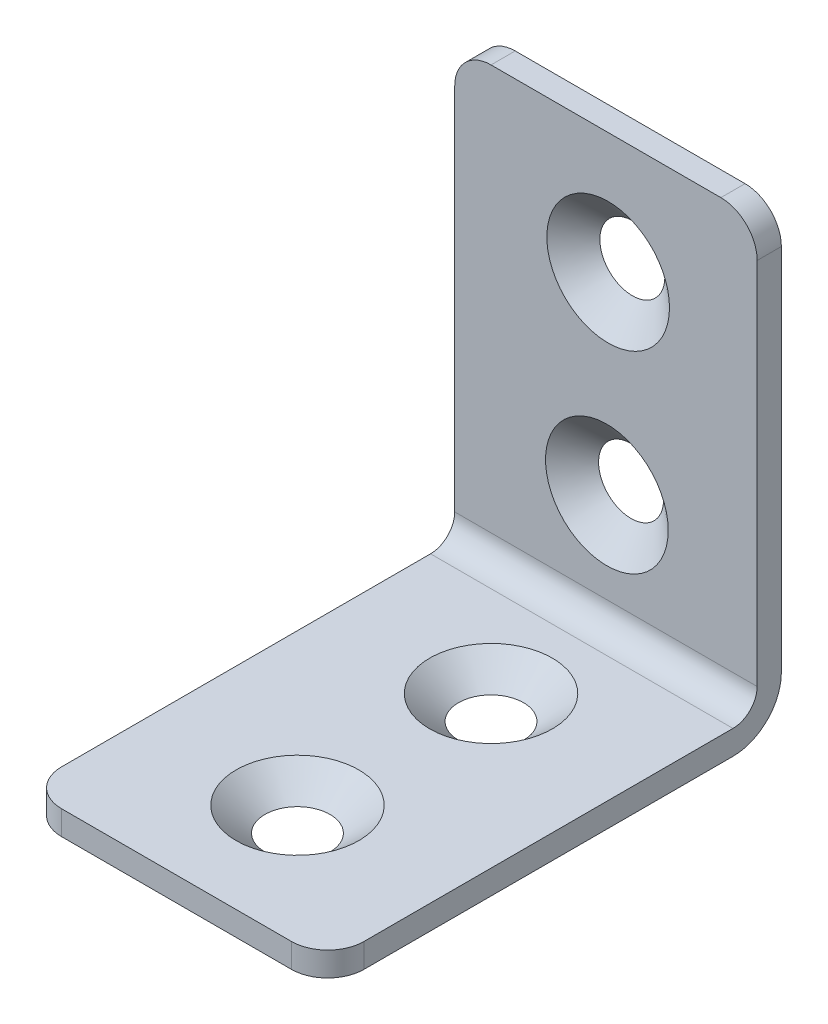
ISO-10303-21;
HEADER;
FILE_DESCRIPTION(('STEP AP214'),'2;1');
FILE_NAME('part.step','',(''),(''),'','','');
FILE_SCHEMA(('AUTOMOTIVE_DESIGN { 1 0 10303 214 1 1 1 1 }'));
ENDSEC;
DATA;
#1=APPLICATION_CONTEXT('core data for automotive mechanical design processes');
#2=APPLICATION_PROTOCOL_DEFINITION('international standard','automotive_design',2000,#1);
#3=PRODUCT_CONTEXT('',#1,'mechanical');
#4=PRODUCT('Part','Part','',(#3));
#5=PRODUCT_RELATED_PRODUCT_CATEGORY('part','',(#4));
#6=PRODUCT_DEFINITION_FORMATION('','',#4);
#7=PRODUCT_DEFINITION_CONTEXT('part definition',#1,'design');
#8=PRODUCT_DEFINITION('design','',#6,#7);
#9=PRODUCT_DEFINITION_SHAPE('','',#8);
#10=(LENGTH_UNIT() NAMED_UNIT(*) SI_UNIT(.MILLI.,.METRE.));
#11=(NAMED_UNIT(*) PLANE_ANGLE_UNIT() SI_UNIT($,.RADIAN.));
#12=(NAMED_UNIT(*) SI_UNIT($,.STERADIAN.) SOLID_ANGLE_UNIT());
#13=UNCERTAINTY_MEASURE_WITH_UNIT(LENGTH_MEASURE(1.E-05),#10,'distance_accuracy_value','');
#14=(GEOMETRIC_REPRESENTATION_CONTEXT(3) GLOBAL_UNCERTAINTY_ASSIGNED_CONTEXT((#13)) GLOBAL_UNIT_ASSIGNED_CONTEXT((#10,
#11,#12)) REPRESENTATION_CONTEXT('',''));
#15=CARTESIAN_POINT('',(0.,0.,0.));
#16=DIRECTION('',(0.,0.,1.));
#17=DIRECTION('',(1.,0.,0.));
#18=AXIS2_PLACEMENT_3D('',#15,#16,#17);
#19=CARTESIAN_POINT('',(0.,0.,2.54));
#20=DIRECTION('',(0.,1.,0.));
#21=DIRECTION('',(0.,0.,1.));
#22=AXIS2_PLACEMENT_3D('',#19,#20,#21);
#23=PLANE('',#22);
#24=CARTESIAN_POINT('',(15.875,0.,34.925));
#25=DIRECTION('',(0.,1.,0.));
#26=DIRECTION('',(0.,0.,1.));
#27=AXIS2_PLACEMENT_3D('',#24,#25,#26);
#28=CIRCLE('',#27,3.41184587481071);
#29=CARTESIAN_POINT('',(15.875,0.,38.3368458748107));
#30=VERTEX_POINT('',#29);
#31=EDGE_CURVE('E48',#30,#30,#28,.T.);
#32=ORIENTED_EDGE('',*,*,#31,.T.);
#33=EDGE_LOOP('',(#32));
#34=FACE_BOUND('',#33,.T.);
#35=CARTESIAN_POINT('',(15.875,0.,14.605));
#36=DIRECTION('',(0.,1.,0.));
#37=DIRECTION('',(0.,0.,1.));
#38=AXIS2_PLACEMENT_3D('',#35,#36,#37);
#39=CIRCLE('',#38,3.41184587481071);
#40=CARTESIAN_POINT('',(15.875,0.,18.0168458748107));
#41=VERTEX_POINT('',#40);
#42=EDGE_CURVE('E219',#41,#41,#39,.T.);
#43=ORIENTED_EDGE('',*,*,#42,.T.);
#44=EDGE_LOOP('',(#43));
#45=FACE_BOUND('',#44,.T.);
#46=DIRECTION('',(-1.,0.,0.));
#47=VECTOR('',#46,1.);
#48=CARTESIAN_POINT('',(31.75,0.,47.625));
#49=LINE('',#48,#47);
#50=CARTESIAN_POINT('',(27.94,0.,47.625));
#51=VERTEX_POINT('',#50);
#52=CARTESIAN_POINT('',(3.81,0.,47.625));
#53=VERTEX_POINT('',#52);
#54=EDGE_CURVE('E209',#51,#53,#49,.T.);
#55=ORIENTED_EDGE('',*,*,#54,.T.);
#56=CARTESIAN_POINT('',(3.81,0.,43.815));
#57=DIRECTION('',(0.,1.,0.));
#58=DIRECTION('',(0.,0.,1.));
#59=AXIS2_PLACEMENT_3D('',#56,#57,#58);
#60=CIRCLE('',#59,3.81);
#61=CARTESIAN_POINT('',(0.,0.,43.815));
#62=VERTEX_POINT('',#61);
#63=EDGE_CURVE('E184',#53,#62,#60,.F.);
#64=ORIENTED_EDGE('',*,*,#63,.T.);
#65=DIRECTION('',(0.,0.,-1.));
#66=VECTOR('',#65,1.);
#67=CARTESIAN_POINT('',(0.,0.,2.54));
#68=LINE('',#67,#66);
#69=CARTESIAN_POINT('',(0.,0.,5.08));
#70=VERTEX_POINT('',#69);
#71=EDGE_CURVE('E146',#62,#70,#68,.T.);
#72=ORIENTED_EDGE('',*,*,#71,.T.);
#73=DIRECTION('',(1.,0.,0.));
#74=VECTOR('',#73,1.);
#75=CARTESIAN_POINT('',(0.,0.,5.08));
#76=LINE('',#75,#74);
#77=CARTESIAN_POINT('',(31.75,0.,5.08));
#78=VERTEX_POINT('',#77);
#79=EDGE_CURVE('E154',#70,#78,#76,.T.);
#80=ORIENTED_EDGE('',*,*,#79,.T.);
#81=DIRECTION('',(0.,0.,-1.));
#82=VECTOR('',#81,1.);
#83=CARTESIAN_POINT('',(31.75,0.,2.54));
#84=LINE('',#83,#82);
#85=CARTESIAN_POINT('',(31.75,0.,43.815));
#86=VERTEX_POINT('',#85);
#87=EDGE_CURVE('E135',#86,#78,#84,.T.);
#88=ORIENTED_EDGE('',*,*,#87,.F.);
#89=CARTESIAN_POINT('',(27.94,0.,43.815));
#90=DIRECTION('',(0.,1.,0.));
#91=DIRECTION('',(0.,0.,1.));
#92=AXIS2_PLACEMENT_3D('',#89,#90,#91);
#93=CIRCLE('',#92,3.81);
#94=EDGE_CURVE('E182',#86,#51,#93,.F.);
#95=ORIENTED_EDGE('',*,*,#94,.T.);
#96=EDGE_LOOP('',(#55,#64,#72,#80,#88,#95));
#97=FACE_BOUND('',#96,.T.);
#98=ADVANCED_FACE('F44',(#34,#45,#97),#23,.F.);
#99=CARTESIAN_POINT('',(0.,0.,0.));
#100=DIRECTION('',(0.,0.,1.));
#101=DIRECTION('',(1.,0.,0.));
#102=AXIS2_PLACEMENT_3D('',#99,#100,#101);
#103=PLANE('',#102);
#104=CARTESIAN_POINT('',(16.1062670991732,34.925,0.));
#105=DIRECTION('',(0.,0.,1.));
#106=DIRECTION('',(1.,0.,0.));
#107=AXIS2_PLACEMENT_3D('',#104,#105,#106);
#108=CIRCLE('',#107,3.4118458748107);
#109=CARTESIAN_POINT('',(19.5181129739839,34.925,0.));
#110=VERTEX_POINT('',#109);
#111=EDGE_CURVE('E211',#110,#110,#108,.T.);
#112=ORIENTED_EDGE('',*,*,#111,.T.);
#113=EDGE_LOOP('',(#112));
#114=FACE_BOUND('',#113,.T.);
#115=CARTESIAN_POINT('',(15.9717116960179,14.605,0.));
#116=DIRECTION('',(0.,0.,1.));
#117=DIRECTION('',(1.,0.,0.));
#118=AXIS2_PLACEMENT_3D('',#115,#116,#117);
#119=CIRCLE('',#118,3.4118458748107);
#120=CARTESIAN_POINT('',(19.3835575708286,14.605,0.));
#121=VERTEX_POINT('',#120);
#122=EDGE_CURVE('E207',#121,#121,#119,.T.);
#123=ORIENTED_EDGE('',*,*,#122,.T.);
#124=EDGE_LOOP('',(#123));
#125=FACE_BOUND('',#124,.T.);
#126=DIRECTION('',(-1.,0.,0.));
#127=VECTOR('',#126,1.);
#128=CARTESIAN_POINT('',(31.75,47.625,0.));
#129=LINE('',#128,#127);
#130=CARTESIAN_POINT('',(27.94,47.625,0.));
#131=VERTEX_POINT('',#130);
#132=CARTESIAN_POINT('',(3.81,47.625,0.));
#133=VERTEX_POINT('',#132);
#134=EDGE_CURVE('E241',#131,#133,#129,.T.);
#135=ORIENTED_EDGE('',*,*,#134,.F.);
#136=CARTESIAN_POINT('',(27.94,43.815,0.));
#137=DIRECTION('',(0.,0.,1.));
#138=DIRECTION('',(1.,0.,0.));
#139=AXIS2_PLACEMENT_3D('',#136,#137,#138);
#140=CIRCLE('',#139,3.81);
#141=CARTESIAN_POINT('',(31.75,43.815,0.));
#142=VERTEX_POINT('',#141);
#143=EDGE_CURVE('E204',#131,#142,#140,.F.);
#144=ORIENTED_EDGE('',*,*,#143,.T.);
#145=DIRECTION('',(0.,1.,0.));
#146=VECTOR('',#145,1.);
#147=CARTESIAN_POINT('',(31.75,0.,0.));
#148=LINE('',#147,#146);
#149=CARTESIAN_POINT('',(31.75,5.08,0.));
#150=VERTEX_POINT('',#149);
#151=EDGE_CURVE('E245',#150,#142,#148,.T.);
#152=ORIENTED_EDGE('',*,*,#151,.F.);
#153=DIRECTION('',(1.,0.,0.));
#154=VECTOR('',#153,1.);
#155=CARTESIAN_POINT('',(0.,5.08,0.));
#156=LINE('',#155,#154);
#157=CARTESIAN_POINT('',(0.,5.08,0.));
#158=VERTEX_POINT('',#157);
#159=EDGE_CURVE('E156',#150,#158,#156,.F.);
#160=ORIENTED_EDGE('',*,*,#159,.T.);
#161=DIRECTION('',(0.,-1.,0.));
#162=VECTOR('',#161,1.);
#163=CARTESIAN_POINT('',(0.,47.625,0.));
#164=LINE('',#163,#162);
#165=CARTESIAN_POINT('',(0.,43.815,0.));
#166=VERTEX_POINT('',#165);
#167=EDGE_CURVE('E236',#166,#158,#164,.T.);
#168=ORIENTED_EDGE('',*,*,#167,.F.);
#169=CARTESIAN_POINT('',(3.81,43.815,0.));
#170=DIRECTION('',(0.,0.,1.));
#171=DIRECTION('',(1.,0.,0.));
#172=AXIS2_PLACEMENT_3D('',#169,#170,#171);
#173=CIRCLE('',#172,3.81);
#174=EDGE_CURVE('E202',#166,#133,#173,.F.);
#175=ORIENTED_EDGE('',*,*,#174,.T.);
#176=EDGE_LOOP('',(#135,#144,#152,#160,#168,#175));
#177=FACE_BOUND('',#176,.T.);
#178=ADVANCED_FACE('F270',(#114,#125,#177),#103,.F.);
#179=CARTESIAN_POINT('',(0.,0.,2.54));
#180=DIRECTION('',(0.,0.,1.));
#181=DIRECTION('',(1.,0.,0.));
#182=AXIS2_PLACEMENT_3D('',#179,#180,#181);
#183=PLANE('',#182);
#184=CARTESIAN_POINT('',(16.1062670991732,34.925,2.54));
#185=DIRECTION('',(0.,0.,1.));
#186=DIRECTION('',(1.,0.,0.));
#187=AXIS2_PLACEMENT_3D('',#184,#185,#186);
#188=CIRCLE('',#187,6.4389);
#189=CARTESIAN_POINT('',(22.5451670991732,34.925,2.54));
#190=VERTEX_POINT('',#189);
#191=EDGE_CURVE('E213',#190,#190,#188,.T.);
#192=ORIENTED_EDGE('',*,*,#191,.F.);
#193=EDGE_LOOP('',(#192));
#194=FACE_BOUND('',#193,.T.);
#195=CARTESIAN_POINT('',(15.9717116960179,14.605,2.54));
#196=DIRECTION('',(0.,0.,1.));
#197=DIRECTION('',(1.,0.,0.));
#198=AXIS2_PLACEMENT_3D('',#195,#196,#197);
#199=CIRCLE('',#198,6.4389);
#200=CARTESIAN_POINT('',(22.4106116960179,14.605,2.54));
#201=VERTEX_POINT('',#200);
#202=EDGE_CURVE('E210',#201,#201,#199,.T.);
#203=ORIENTED_EDGE('',*,*,#202,.F.);
#204=EDGE_LOOP('',(#203));
#205=FACE_BOUND('',#204,.T.);
#206=DIRECTION('',(0.,1.,0.));
#207=VECTOR('',#206,1.);
#208=CARTESIAN_POINT('',(31.75,0.,2.54));
#209=LINE('',#208,#207);
#210=CARTESIAN_POINT('',(31.75,5.08,2.54));
#211=VERTEX_POINT('',#210);
#212=CARTESIAN_POINT('',(31.75,43.815,2.54));
#213=VERTEX_POINT('',#212);
#214=EDGE_CURVE('E240',#211,#213,#209,.T.);
#215=ORIENTED_EDGE('',*,*,#214,.T.);
#216=CARTESIAN_POINT('',(27.94,43.815,2.54));
#217=DIRECTION('',(0.,0.,1.));
#218=DIRECTION('',(1.,0.,0.));
#219=AXIS2_PLACEMENT_3D('',#216,#217,#218);
#220=CIRCLE('',#219,3.81);
#221=CARTESIAN_POINT('',(27.94,47.625,2.54));
#222=VERTEX_POINT('',#221);
#223=EDGE_CURVE('E13',#213,#222,#220,.T.);
#224=ORIENTED_EDGE('',*,*,#223,.T.);
#225=DIRECTION('',(-1.,0.,0.));
#226=VECTOR('',#225,1.);
#227=CARTESIAN_POINT('',(31.75,47.625,2.54));
#228=LINE('',#227,#226);
#229=CARTESIAN_POINT('',(3.81,47.625,2.54));
#230=VERTEX_POINT('',#229);
#231=EDGE_CURVE('E147',#222,#230,#228,.T.);
#232=ORIENTED_EDGE('',*,*,#231,.T.);
#233=CARTESIAN_POINT('',(3.81,43.815,2.54));
#234=DIRECTION('',(0.,0.,1.));
#235=DIRECTION('',(1.,0.,0.));
#236=AXIS2_PLACEMENT_3D('',#233,#234,#235);
#237=CIRCLE('',#236,3.81);
#238=CARTESIAN_POINT('',(0.,43.815,2.54));
#239=VERTEX_POINT('',#238);
#240=EDGE_CURVE('E53',#230,#239,#237,.T.);
#241=ORIENTED_EDGE('',*,*,#240,.T.);
#242=DIRECTION('',(0.,-1.,0.));
#243=VECTOR('',#242,1.);
#244=CARTESIAN_POINT('',(0.,47.625,2.54));
#245=LINE('',#244,#243);
#246=CARTESIAN_POINT('',(0.,5.08,2.54));
#247=VERTEX_POINT('',#246);
#248=EDGE_CURVE('E238',#239,#247,#245,.T.);
#249=ORIENTED_EDGE('',*,*,#248,.T.);
#250=DIRECTION('',(1.,0.,0.));
#251=VECTOR('',#250,1.);
#252=CARTESIAN_POINT('',(0.,5.08,2.54));
#253=LINE('',#252,#251);
#254=EDGE_CURVE('E167',#247,#211,#253,.T.);
#255=ORIENTED_EDGE('',*,*,#254,.T.);
#256=EDGE_LOOP('',(#215,#224,#232,#241,#249,#255));
#257=FACE_BOUND('',#256,.T.);
#258=ADVANCED_FACE('F255',(#194,#205,#257),#183,.T.);
#259=CARTESIAN_POINT('',(0.,47.625,2.54));
#260=DIRECTION('',(1.,0.,0.));
#261=DIRECTION('',(0.,1.,0.));
#262=AXIS2_PLACEMENT_3D('',#259,#260,#261);
#263=PLANE('',#262);
#264=ORIENTED_EDGE('',*,*,#71,.F.);
#265=DIRECTION('',(0.,-1.,0.));
#266=VECTOR('',#265,1.);
#267=CARTESIAN_POINT('',(0.,2.54,43.815));
#268=LINE('',#267,#266);
#269=CARTESIAN_POINT('',(0.,2.54,43.815));
#270=VERTEX_POINT('',#269);
#271=EDGE_CURVE('E189',#62,#270,#268,.F.);
#272=ORIENTED_EDGE('',*,*,#271,.T.);
#273=DIRECTION('',(0.,0.,1.));
#274=VECTOR('',#273,1.);
#275=CARTESIAN_POINT('',(0.,2.54,2.54));
#276=LINE('',#275,#274);
#277=CARTESIAN_POINT('',(0.,2.54,5.08));
#278=VERTEX_POINT('',#277);
#279=EDGE_CURVE('E233',#278,#270,#276,.T.);
#280=ORIENTED_EDGE('',*,*,#279,.F.);
#281=CARTESIAN_POINT('',(0.,5.08,5.08));
#282=DIRECTION('',(1.,0.,0.));
#283=DIRECTION('',(0.,1.,0.));
#284=AXIS2_PLACEMENT_3D('',#281,#282,#283);
#285=CIRCLE('',#284,2.54);
#286=EDGE_CURVE('E174',#278,#247,#285,.T.);
#287=ORIENTED_EDGE('',*,*,#286,.T.);
#288=ORIENTED_EDGE('',*,*,#248,.F.);
#289=DIRECTION('',(0.,0.,-1.));
#290=VECTOR('',#289,1.);
#291=CARTESIAN_POINT('',(0.,43.815,2.54));
#292=LINE('',#291,#290);
#293=EDGE_CURVE('E186',#239,#166,#292,.T.);
#294=ORIENTED_EDGE('',*,*,#293,.T.);
#295=ORIENTED_EDGE('',*,*,#167,.T.);
#296=CARTESIAN_POINT('',(0.,5.08,5.08));
#297=DIRECTION('',(1.,0.,0.));
#298=DIRECTION('',(0.,1.,0.));
#299=AXIS2_PLACEMENT_3D('',#296,#297,#298);
#300=CIRCLE('',#299,5.08);
#301=EDGE_CURVE('E165',#158,#70,#300,.F.);
#302=ORIENTED_EDGE('',*,*,#301,.T.);
#303=EDGE_LOOP('',(#264,#272,#280,#287,#288,#294,#295,#302));
#304=FACE_BOUND('',#303,.T.);
#305=ADVANCED_FACE('F257',(#304),#263,.F.);
#306=CARTESIAN_POINT('',(31.75,0.,2.54));
#307=DIRECTION('',(-1.,0.,0.));
#308=DIRECTION('',(0.,0.,1.));
#309=AXIS2_PLACEMENT_3D('',#306,#307,#308);
#310=PLANE('',#309);
#311=DIRECTION('',(0.,0.,1.));
#312=VECTOR('',#311,1.);
#313=CARTESIAN_POINT('',(31.75,2.54,2.54));
#314=LINE('',#313,#312);
#315=CARTESIAN_POINT('',(31.75,2.54,5.08));
#316=VERTEX_POINT('',#315);
#317=CARTESIAN_POINT('',(31.75,2.54,43.815));
#318=VERTEX_POINT('',#317);
#319=EDGE_CURVE('E228',#316,#318,#314,.T.);
#320=ORIENTED_EDGE('',*,*,#319,.T.);
#321=DIRECTION('',(0.,-1.,0.));
#322=VECTOR('',#321,1.);
#323=CARTESIAN_POINT('',(31.75,0.,43.815));
#324=LINE('',#323,#322);
#325=EDGE_CURVE('E143',#318,#86,#324,.T.);
#326=ORIENTED_EDGE('',*,*,#325,.T.);
#327=ORIENTED_EDGE('',*,*,#87,.T.);
#328=CARTESIAN_POINT('',(31.75,5.08,5.08));
#329=DIRECTION('',(-1.,0.,0.));
#330=DIRECTION('',(0.,0.,1.));
#331=AXIS2_PLACEMENT_3D('',#328,#329,#330);
#332=CIRCLE('',#331,5.08);
#333=EDGE_CURVE('E140',#78,#150,#332,.F.);
#334=ORIENTED_EDGE('',*,*,#333,.T.);
#335=ORIENTED_EDGE('',*,*,#151,.T.);
#336=DIRECTION('',(0.,0.,-1.));
#337=VECTOR('',#336,1.);
#338=CARTESIAN_POINT('',(31.75,43.815,2.54));
#339=LINE('',#338,#337);
#340=EDGE_CURVE('E195',#142,#213,#339,.F.);
#341=ORIENTED_EDGE('',*,*,#340,.T.);
#342=ORIENTED_EDGE('',*,*,#214,.F.);
#343=CARTESIAN_POINT('',(31.75,5.08,5.08));
#344=DIRECTION('',(-1.,0.,0.));
#345=DIRECTION('',(0.,0.,1.));
#346=AXIS2_PLACEMENT_3D('',#343,#344,#345);
#347=CIRCLE('',#346,2.54);
#348=EDGE_CURVE('E172',#211,#316,#347,.T.);
#349=ORIENTED_EDGE('',*,*,#348,.T.);
#350=EDGE_LOOP('',(#320,#326,#327,#334,#335,#341,#342,#349));
#351=FACE_BOUND('',#350,.T.);
#352=ADVANCED_FACE('F138',(#351),#310,.F.);
#353=CARTESIAN_POINT('',(31.75,47.625,2.54));
#354=DIRECTION('',(0.,-1.,0.));
#355=DIRECTION('',(1.,0.,0.));
#356=AXIS2_PLACEMENT_3D('',#353,#354,#355);
#357=PLANE('',#356);
#358=ORIENTED_EDGE('',*,*,#231,.F.);
#359=DIRECTION('',(0.,0.,-1.));
#360=VECTOR('',#359,1.);
#361=CARTESIAN_POINT('',(27.94,47.625,2.54));
#362=LINE('',#361,#360);
#363=EDGE_CURVE('E199',#222,#131,#362,.T.);
#364=ORIENTED_EDGE('',*,*,#363,.T.);
#365=ORIENTED_EDGE('',*,*,#134,.T.);
#366=DIRECTION('',(0.,0.,-1.));
#367=VECTOR('',#366,1.);
#368=CARTESIAN_POINT('',(3.81,47.625,2.54));
#369=LINE('',#368,#367);
#370=EDGE_CURVE('E61',#133,#230,#369,.F.);
#371=ORIENTED_EDGE('',*,*,#370,.T.);
#372=EDGE_LOOP('',(#358,#364,#365,#371));
#373=FACE_BOUND('',#372,.T.);
#374=ADVANCED_FACE('F248',(#373),#357,.F.);
#375=CARTESIAN_POINT('',(31.75,2.54,47.625));
#376=DIRECTION('',(0.,0.,1.));
#377=DIRECTION('',(1.,0.,0.));
#378=AXIS2_PLACEMENT_3D('',#375,#376,#377);
#379=PLANE('',#378);
#380=DIRECTION('',(-1.,0.,0.));
#381=VECTOR('',#380,1.);
#382=CARTESIAN_POINT('',(31.75,2.54,47.625));
#383=LINE('',#382,#381);
#384=CARTESIAN_POINT('',(27.94,2.54,47.625));
#385=VERTEX_POINT('',#384);
#386=CARTESIAN_POINT('',(3.81,2.54,47.625));
#387=VERTEX_POINT('',#386);
#388=EDGE_CURVE('E230',#385,#387,#383,.T.);
#389=ORIENTED_EDGE('',*,*,#388,.T.);
#390=DIRECTION('',(0.,-1.,0.));
#391=VECTOR('',#390,1.);
#392=CARTESIAN_POINT('',(3.81,0.,47.625));
#393=LINE('',#392,#391);
#394=EDGE_CURVE('E179',#387,#53,#393,.T.);
#395=ORIENTED_EDGE('',*,*,#394,.T.);
#396=ORIENTED_EDGE('',*,*,#54,.F.);
#397=DIRECTION('',(0.,-1.,0.));
#398=VECTOR('',#397,1.);
#399=CARTESIAN_POINT('',(27.94,2.54,47.625));
#400=LINE('',#399,#398);
#401=EDGE_CURVE('E177',#51,#385,#400,.F.);
#402=ORIENTED_EDGE('',*,*,#401,.T.);
#403=EDGE_LOOP('',(#389,#395,#396,#402));
#404=FACE_BOUND('',#403,.T.);
#405=ADVANCED_FACE('F281',(#404),#379,.T.);
#406=CARTESIAN_POINT('',(0.,2.54,0.));
#407=DIRECTION('',(0.,-1.,0.));
#408=DIRECTION('',(0.,0.,-1.));
#409=AXIS2_PLACEMENT_3D('',#406,#407,#408);
#410=PLANE('',#409);
#411=CARTESIAN_POINT('',(15.875,2.54,34.925));
#412=DIRECTION('',(0.,1.,0.));
#413=DIRECTION('',(0.,0.,1.));
#414=AXIS2_PLACEMENT_3D('',#411,#412,#413);
#415=CIRCLE('',#414,6.4389);
#416=CARTESIAN_POINT('',(15.875,2.54,41.3639));
#417=VERTEX_POINT('',#416);
#418=EDGE_CURVE('E445',#417,#417,#415,.T.);
#419=ORIENTED_EDGE('',*,*,#418,.F.);
#420=EDGE_LOOP('',(#419));
#421=FACE_BOUND('',#420,.T.);
#422=CARTESIAN_POINT('',(15.875,2.54,14.605));
#423=DIRECTION('',(0.,1.,0.));
#424=DIRECTION('',(0.,0.,1.));
#425=AXIS2_PLACEMENT_3D('',#422,#423,#424);
#426=CIRCLE('',#425,6.4389);
#427=CARTESIAN_POINT('',(15.875,2.54,21.0439));
#428=VERTEX_POINT('',#427);
#429=EDGE_CURVE('E224',#428,#428,#426,.T.);
#430=ORIENTED_EDGE('',*,*,#429,.F.);
#431=EDGE_LOOP('',(#430));
#432=FACE_BOUND('',#431,.T.);
#433=ORIENTED_EDGE('',*,*,#279,.T.);
#434=CARTESIAN_POINT('',(3.81,2.54,43.815));
#435=DIRECTION('',(0.,-1.,0.));
#436=DIRECTION('',(0.,0.,-1.));
#437=AXIS2_PLACEMENT_3D('',#434,#435,#436);
#438=CIRCLE('',#437,3.81);
#439=EDGE_CURVE('E193',#270,#387,#438,.F.);
#440=ORIENTED_EDGE('',*,*,#439,.T.);
#441=ORIENTED_EDGE('',*,*,#388,.F.);
#442=CARTESIAN_POINT('',(27.94,2.54,43.815));
#443=DIRECTION('',(0.,-1.,0.));
#444=DIRECTION('',(0.,0.,-1.));
#445=AXIS2_PLACEMENT_3D('',#442,#443,#444);
#446=CIRCLE('',#445,3.81);
#447=EDGE_CURVE('E191',#385,#318,#446,.F.);
#448=ORIENTED_EDGE('',*,*,#447,.T.);
#449=ORIENTED_EDGE('',*,*,#319,.F.);
#450=DIRECTION('',(1.,0.,0.));
#451=VECTOR('',#450,1.);
#452=CARTESIAN_POINT('',(0.,2.54,5.08));
#453=LINE('',#452,#451);
#454=EDGE_CURVE('E170',#316,#278,#453,.F.);
#455=ORIENTED_EDGE('',*,*,#454,.T.);
#456=EDGE_LOOP('',(#433,#440,#441,#448,#449,#455));
#457=FACE_BOUND('',#456,.T.);
#458=ADVANCED_FACE('F278',(#421,#432,#457),#410,.F.);
#459=CARTESIAN_POINT('',(0.,5.08,5.08));
#460=DIRECTION('',(1.,0.,0.));
#461=DIRECTION('',(0.,0.,-1.));
#462=AXIS2_PLACEMENT_3D('',#459,#460,#461);
#463=CYLINDRICAL_SURFACE('',#462,5.08);
#464=ORIENTED_EDGE('',*,*,#301,.F.);
#465=ORIENTED_EDGE('',*,*,#159,.F.);
#466=ORIENTED_EDGE('',*,*,#333,.F.);
#467=ORIENTED_EDGE('',*,*,#79,.F.);
#468=EDGE_LOOP('',(#464,#465,#466,#467));
#469=FACE_BOUND('',#468,.T.);
#470=ADVANCED_FACE('F153',(#469),#463,.T.);
#471=CARTESIAN_POINT('',(0.,5.08,5.08));
#472=DIRECTION('',(1.,0.,0.));
#473=DIRECTION('',(0.,0.,-1.));
#474=AXIS2_PLACEMENT_3D('',#471,#472,#473);
#475=CYLINDRICAL_SURFACE('',#474,2.54);
#476=ORIENTED_EDGE('',*,*,#286,.F.);
#477=ORIENTED_EDGE('',*,*,#454,.F.);
#478=ORIENTED_EDGE('',*,*,#348,.F.);
#479=ORIENTED_EDGE('',*,*,#254,.F.);
#480=EDGE_LOOP('',(#476,#477,#478,#479));
#481=FACE_BOUND('',#480,.T.);
#482=ADVANCED_FACE('F264',(#481),#475,.F.);
#483=CARTESIAN_POINT('',(3.81,2.54,43.815));
#484=DIRECTION('',(0.,1.,0.));
#485=DIRECTION('',(-1.,0.,0.));
#486=AXIS2_PLACEMENT_3D('',#483,#484,#485);
#487=CYLINDRICAL_SURFACE('',#486,3.81);
#488=ORIENTED_EDGE('',*,*,#439,.F.);
#489=ORIENTED_EDGE('',*,*,#271,.F.);
#490=ORIENTED_EDGE('',*,*,#63,.F.);
#491=ORIENTED_EDGE('',*,*,#394,.F.);
#492=EDGE_LOOP('',(#488,#489,#490,#491));
#493=FACE_BOUND('',#492,.T.);
#494=ADVANCED_FACE('F274',(#493),#487,.T.);
#495=CARTESIAN_POINT('',(27.94,0.,43.815));
#496=DIRECTION('',(0.,1.,0.));
#497=DIRECTION('',(0.,0.,1.));
#498=AXIS2_PLACEMENT_3D('',#495,#496,#497);
#499=CYLINDRICAL_SURFACE('',#498,3.81);
#500=ORIENTED_EDGE('',*,*,#447,.F.);
#501=ORIENTED_EDGE('',*,*,#401,.F.);
#502=ORIENTED_EDGE('',*,*,#94,.F.);
#503=ORIENTED_EDGE('',*,*,#325,.F.);
#504=EDGE_LOOP('',(#500,#501,#502,#503));
#505=FACE_BOUND('',#504,.T.);
#506=ADVANCED_FACE('F285',(#505),#499,.T.);
#507=CARTESIAN_POINT('',(27.94,43.815,2.54));
#508=DIRECTION('',(0.,0.,-1.));
#509=DIRECTION('',(-1.,0.,0.));
#510=AXIS2_PLACEMENT_3D('',#507,#508,#509);
#511=CYLINDRICAL_SURFACE('',#510,3.81);
#512=ORIENTED_EDGE('',*,*,#223,.F.);
#513=ORIENTED_EDGE('',*,*,#340,.F.);
#514=ORIENTED_EDGE('',*,*,#143,.F.);
#515=ORIENTED_EDGE('',*,*,#363,.F.);
#516=EDGE_LOOP('',(#512,#513,#514,#515));
#517=FACE_BOUND('',#516,.T.);
#518=ADVANCED_FACE('F269',(#517),#511,.T.);
#519=CARTESIAN_POINT('',(3.81,43.815,2.54));
#520=DIRECTION('',(0.,0.,-1.));
#521=DIRECTION('',(-1.,0.,0.));
#522=AXIS2_PLACEMENT_3D('',#519,#520,#521);
#523=CYLINDRICAL_SURFACE('',#522,3.81);
#524=ORIENTED_EDGE('',*,*,#240,.F.);
#525=ORIENTED_EDGE('',*,*,#370,.F.);
#526=ORIENTED_EDGE('',*,*,#174,.F.);
#527=ORIENTED_EDGE('',*,*,#293,.F.);
#528=EDGE_LOOP('',(#524,#525,#526,#527));
#529=FACE_BOUND('',#528,.T.);
#530=ADVANCED_FACE('F46',(#529),#523,.T.);
#531=CARTESIAN_POINT('',(15.9717116960179,14.605,2.54));
#532=DIRECTION('',(0.,0.,1.));
#533=DIRECTION('',(1.,0.,0.));
#534=AXIS2_PLACEMENT_3D('',#531,#532,#533);
#535=CONICAL_SURFACE('',#534,6.4389,0.872664625997166);
#536=ORIENTED_EDGE('',*,*,#202,.T.);
#537=EDGE_LOOP('',(#536));
#538=FACE_BOUND('',#537,.T.);
#539=ORIENTED_EDGE('',*,*,#122,.F.);
#540=EDGE_LOOP('',(#539));
#541=FACE_BOUND('',#540,.T.);
#542=ADVANCED_FACE('F344',(#538,#541),#535,.F.);
#543=CARTESIAN_POINT('',(16.1062670991732,34.925,2.54));
#544=DIRECTION('',(0.,0.,1.));
#545=DIRECTION('',(1.,0.,0.));
#546=AXIS2_PLACEMENT_3D('',#543,#544,#545);
#547=CONICAL_SURFACE('',#546,6.4389,0.872664625997166);
#548=ORIENTED_EDGE('',*,*,#191,.T.);
#549=EDGE_LOOP('',(#548));
#550=FACE_BOUND('',#549,.T.);
#551=ORIENTED_EDGE('',*,*,#111,.F.);
#552=EDGE_LOOP('',(#551));
#553=FACE_BOUND('',#552,.T.);
#554=ADVANCED_FACE('F369',(#550,#553),#547,.F.);
#555=CARTESIAN_POINT('',(15.875,2.54,14.605));
#556=DIRECTION('',(0.,1.,0.));
#557=DIRECTION('',(0.,0.,1.));
#558=AXIS2_PLACEMENT_3D('',#555,#556,#557);
#559=CONICAL_SURFACE('',#558,6.4389,0.872664625997164);
#560=ORIENTED_EDGE('',*,*,#429,.T.);
#561=EDGE_LOOP('',(#560));
#562=FACE_BOUND('',#561,.T.);
#563=ORIENTED_EDGE('',*,*,#42,.F.);
#564=EDGE_LOOP('',(#563));
#565=FACE_BOUND('',#564,.T.);
#566=ADVANCED_FACE('F378',(#562,#565),#559,.F.);
#567=CARTESIAN_POINT('',(15.875,2.54,34.925));
#568=DIRECTION('',(0.,1.,0.));
#569=DIRECTION('',(0.,0.,1.));
#570=AXIS2_PLACEMENT_3D('',#567,#568,#569);
#571=CONICAL_SURFACE('',#570,6.4389,0.872664625997164);
#572=ORIENTED_EDGE('',*,*,#418,.T.);
#573=EDGE_LOOP('',(#572));
#574=FACE_BOUND('',#573,.T.);
#575=ORIENTED_EDGE('',*,*,#31,.F.);
#576=EDGE_LOOP('',(#575));
#577=FACE_BOUND('',#576,.T.);
#578=ADVANCED_FACE('F402',(#574,#577),#571,.F.);
#579=CLOSED_SHELL('',(#98,#178,#258,#305,#352,#374,#405,#458,#470,#482,#494,#506,#518,#530,#542,
#554,#566,#578));
#580=MANIFOLD_SOLID_BREP('B2',#579);
#581=ADVANCED_BREP_SHAPE_REPRESENTATION('',(#18,#580),#14);
#582=SHAPE_DEFINITION_REPRESENTATION(#9,#581);
ENDSEC;
END-ISO-10303-21;
